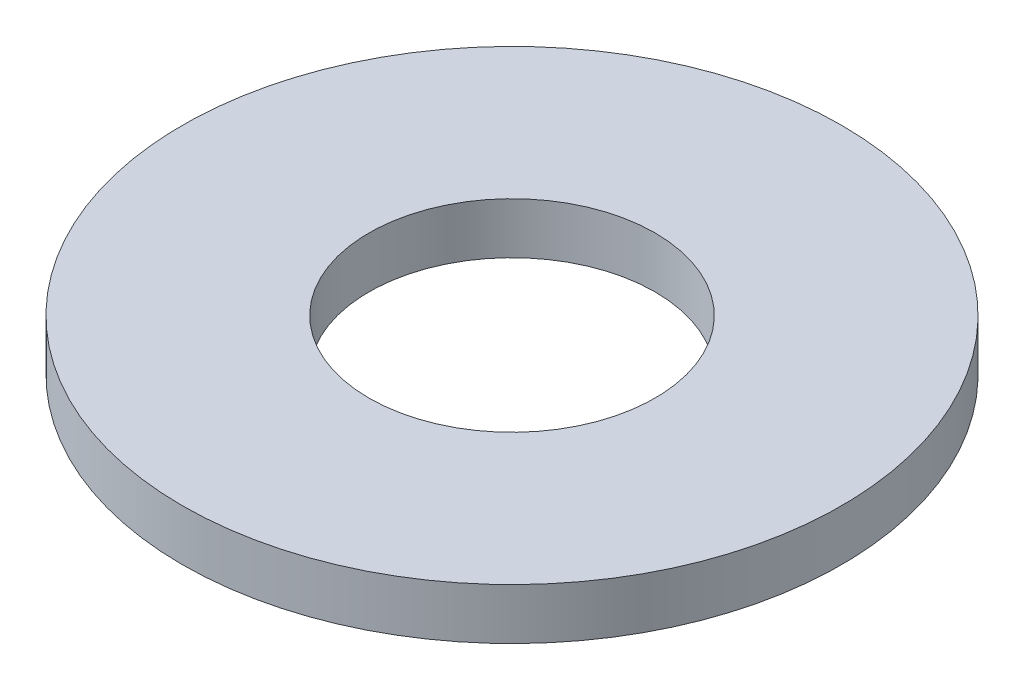
ISO-10303-21;
HEADER;
FILE_DESCRIPTION(('STEP AP214'),'2;1');
FILE_NAME('part.step','',(''),(''),'','','');
FILE_SCHEMA(('AUTOMOTIVE_DESIGN { 1 0 10303 214 1 1 1 1 }'));
ENDSEC;
DATA;
#1=APPLICATION_CONTEXT('core data for automotive mechanical design processes');
#2=APPLICATION_PROTOCOL_DEFINITION('international standard','automotive_design',2000,#1);
#3=PRODUCT_CONTEXT('',#1,'mechanical');
#4=PRODUCT('Part','Part','',(#3));
#5=PRODUCT_RELATED_PRODUCT_CATEGORY('part','',(#4));
#6=PRODUCT_DEFINITION_FORMATION('','',#4);
#7=PRODUCT_DEFINITION_CONTEXT('part definition',#1,'design');
#8=PRODUCT_DEFINITION('design','',#6,#7);
#9=PRODUCT_DEFINITION_SHAPE('','',#8);
#10=(LENGTH_UNIT() NAMED_UNIT(*) SI_UNIT(.MILLI.,.METRE.));
#11=(NAMED_UNIT(*) PLANE_ANGLE_UNIT() SI_UNIT($,.RADIAN.));
#12=(NAMED_UNIT(*) SI_UNIT($,.STERADIAN.) SOLID_ANGLE_UNIT());
#13=UNCERTAINTY_MEASURE_WITH_UNIT(LENGTH_MEASURE(1.E-05),#10,'distance_accuracy_value','');
#14=(GEOMETRIC_REPRESENTATION_CONTEXT(3) GLOBAL_UNCERTAINTY_ASSIGNED_CONTEXT((#13)) GLOBAL_UNIT_ASSIGNED_CONTEXT((#10,
#11,#12)) REPRESENTATION_CONTEXT('',''));
#15=CARTESIAN_POINT('',(0.,0.,0.));
#16=DIRECTION('',(0.,0.,1.));
#17=DIRECTION('',(1.,0.,0.));
#18=AXIS2_PLACEMENT_3D('',#15,#16,#17);
#19=CARTESIAN_POINT('',(0.,1.,0.));
#20=DIRECTION('',(0.,1.,0.));
#21=DIRECTION('',(0.,0.,1.));
#22=AXIS2_PLACEMENT_3D('',#19,#20,#21);
#23=PLANE('',#22);
#24=CARTESIAN_POINT('',(0.,1.,0.));
#25=DIRECTION('',(0.,1.,0.));
#26=DIRECTION('',(0.,0.,1.));
#27=AXIS2_PLACEMENT_3D('',#24,#25,#26);
#28=CIRCLE('',#27,6.45);
#29=CARTESIAN_POINT('',(0.,1.,6.45));
#30=VERTEX_POINT('',#29);
#31=EDGE_CURVE('E10',#30,#30,#28,.T.);
#32=ORIENTED_EDGE('',*,*,#31,.T.);
#33=EDGE_LOOP('',(#32));
#34=FACE_BOUND('',#33,.T.);
#35=CARTESIAN_POINT('',(0.,1.,0.));
#36=DIRECTION('',(0.,1.,0.));
#37=DIRECTION('',(0.,0.,1.));
#38=AXIS2_PLACEMENT_3D('',#35,#36,#37);
#39=CIRCLE('',#38,2.8);
#40=CARTESIAN_POINT('',(0.,1.,2.8));
#41=VERTEX_POINT('',#40);
#42=EDGE_CURVE('E52',#41,#41,#39,.T.);
#43=ORIENTED_EDGE('',*,*,#42,.F.);
#44=EDGE_LOOP('',(#43));
#45=FACE_BOUND('',#44,.T.);
#46=ADVANCED_FACE('F38',(#34,#45),#23,.T.);
#47=CARTESIAN_POINT('',(0.,0.,0.));
#48=DIRECTION('',(0.,1.,0.));
#49=DIRECTION('',(0.,0.,1.));
#50=AXIS2_PLACEMENT_3D('',#47,#48,#49);
#51=PLANE('',#50);
#52=CARTESIAN_POINT('',(0.,0.,0.));
#53=DIRECTION('',(0.,1.,0.));
#54=DIRECTION('',(0.,0.,1.));
#55=AXIS2_PLACEMENT_3D('',#52,#53,#54);
#56=CIRCLE('',#55,6.45);
#57=CARTESIAN_POINT('',(0.,0.,6.45));
#58=VERTEX_POINT('',#57);
#59=EDGE_CURVE('E42',#58,#58,#56,.T.);
#60=ORIENTED_EDGE('',*,*,#59,.F.);
#61=EDGE_LOOP('',(#60));
#62=FACE_BOUND('',#61,.T.);
#63=CARTESIAN_POINT('',(0.,0.,0.));
#64=DIRECTION('',(0.,1.,0.));
#65=DIRECTION('',(0.,0.,1.));
#66=AXIS2_PLACEMENT_3D('',#63,#64,#65);
#67=CIRCLE('',#66,2.8);
#68=CARTESIAN_POINT('',(0.,0.,2.8));
#69=VERTEX_POINT('',#68);
#70=EDGE_CURVE('E54',#69,#69,#67,.T.);
#71=ORIENTED_EDGE('',*,*,#70,.T.);
#72=EDGE_LOOP('',(#71));
#73=FACE_BOUND('',#72,.T.);
#74=ADVANCED_FACE('F65',(#62,#73),#51,.F.);
#75=CARTESIAN_POINT('',(0.,1.,0.));
#76=DIRECTION('',(0.,-1.,0.));
#77=DIRECTION('',(0.,0.,-1.));
#78=AXIS2_PLACEMENT_3D('',#75,#76,#77);
#79=CYLINDRICAL_SURFACE('',#78,6.45);
#80=ORIENTED_EDGE('',*,*,#31,.F.);
#81=EDGE_LOOP('',(#80));
#82=FACE_BOUND('',#81,.T.);
#83=ORIENTED_EDGE('',*,*,#59,.T.);
#84=EDGE_LOOP('',(#83));
#85=FACE_BOUND('',#84,.T.);
#86=ADVANCED_FACE('F40',(#82,#85),#79,.T.);
#87=CARTESIAN_POINT('',(0.,1.,0.));
#88=DIRECTION('',(0.,-1.,0.));
#89=DIRECTION('',(0.,0.,-1.));
#90=AXIS2_PLACEMENT_3D('',#87,#88,#89);
#91=CYLINDRICAL_SURFACE('',#90,2.8);
#92=ORIENTED_EDGE('',*,*,#42,.T.);
#93=EDGE_LOOP('',(#92));
#94=FACE_BOUND('',#93,.T.);
#95=ORIENTED_EDGE('',*,*,#70,.F.);
#96=EDGE_LOOP('',(#95));
#97=FACE_BOUND('',#96,.T.);
#98=ADVANCED_FACE('F61',(#94,#97),#91,.F.);
#99=CLOSED_SHELL('',(#46,#74,#86,#98));
#100=MANIFOLD_SOLID_BREP('B2',#99);
#101=ADVANCED_BREP_SHAPE_REPRESENTATION('',(#18,#100),#14);
#102=SHAPE_DEFINITION_REPRESENTATION(#9,#101);
ENDSEC;
END-ISO-10303-21;
